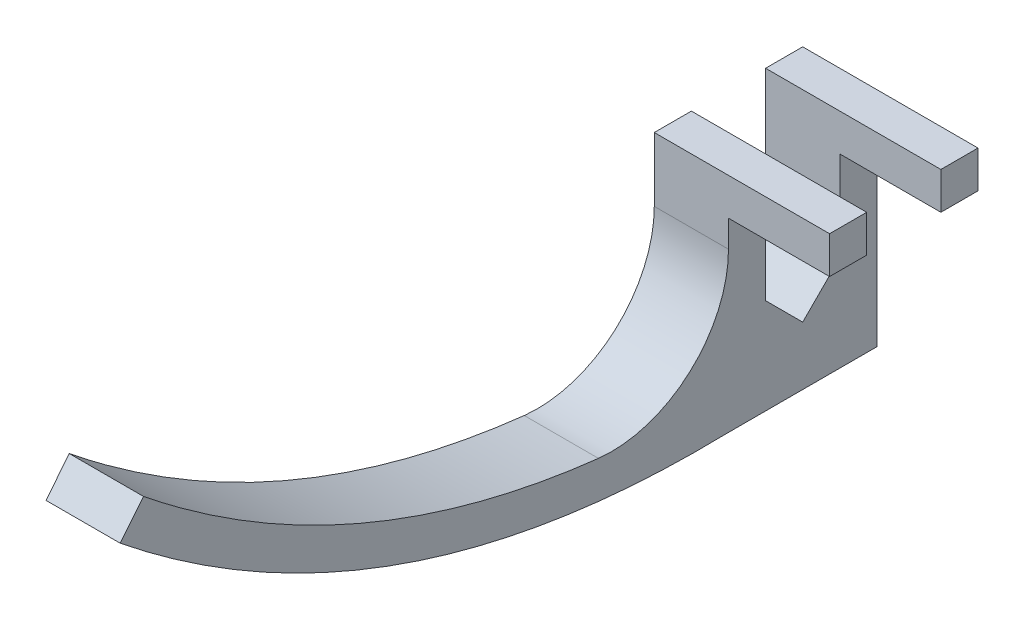
ISO-10303-21;
HEADER;
FILE_DESCRIPTION(('STEP AP214'),'2;1');
FILE_NAME('part.step','',(''),(''),'','','');
FILE_SCHEMA(('AUTOMOTIVE_DESIGN { 1 0 10303 214 1 1 1 1 }'));
ENDSEC;
DATA;
#1=APPLICATION_CONTEXT('core data for automotive mechanical design processes');
#2=APPLICATION_PROTOCOL_DEFINITION('international standard','automotive_design',2000,#1);
#3=PRODUCT_CONTEXT('',#1,'mechanical');
#4=PRODUCT('Part','Part','',(#3));
#5=PRODUCT_RELATED_PRODUCT_CATEGORY('part','',(#4));
#6=PRODUCT_DEFINITION_FORMATION('','',#4);
#7=PRODUCT_DEFINITION_CONTEXT('part definition',#1,'design');
#8=PRODUCT_DEFINITION('design','',#6,#7);
#9=PRODUCT_DEFINITION_SHAPE('','',#8);
#10=(LENGTH_UNIT() NAMED_UNIT(*) SI_UNIT(.MILLI.,.METRE.));
#11=(NAMED_UNIT(*) PLANE_ANGLE_UNIT() SI_UNIT($,.RADIAN.));
#12=(NAMED_UNIT(*) SI_UNIT($,.STERADIAN.) SOLID_ANGLE_UNIT());
#13=UNCERTAINTY_MEASURE_WITH_UNIT(LENGTH_MEASURE(1.E-05),#10,'distance_accuracy_value','');
#14=(GEOMETRIC_REPRESENTATION_CONTEXT(3) GLOBAL_UNCERTAINTY_ASSIGNED_CONTEXT((#13)) GLOBAL_UNIT_ASSIGNED_CONTEXT((#10,
#11,#12)) REPRESENTATION_CONTEXT('',''));
#15=CARTESIAN_POINT('',(0.,0.,0.));
#16=DIRECTION('',(0.,0.,1.));
#17=DIRECTION('',(1.,0.,0.));
#18=AXIS2_PLACEMENT_3D('',#15,#16,#17);
#19=CARTESIAN_POINT('',(12.7,0.,0.));
#20=DIRECTION('',(1.,0.,0.));
#21=DIRECTION('',(0.,0.,-1.));
#22=AXIS2_PLACEMENT_3D('',#19,#20,#21);
#23=PLANE('',#22);
#24=DIRECTION('',(0.,1.,0.));
#25=VECTOR('',#24,1.);
#26=CARTESIAN_POINT('',(12.7,0.,-98.2479628947368));
#27=LINE('',#26,#25);
#28=CARTESIAN_POINT('',(12.7,0.,-98.2479628947368));
#29=VERTEX_POINT('',#28);
#30=CARTESIAN_POINT('',(12.7,31.75,-98.2479628947368));
#31=VERTEX_POINT('',#30);
#32=EDGE_CURVE('E311',#29,#31,#27,.T.);
#33=ORIENTED_EDGE('',*,*,#32,.T.);
#34=DIRECTION('',(0.,0.,-1.));
#35=VECTOR('',#34,1.);
#36=CARTESIAN_POINT('',(12.7,31.75,-91.8979628947368));
#37=LINE('',#36,#35);
#38=CARTESIAN_POINT('',(12.7,31.75,-91.8979628947368));
#39=VERTEX_POINT('',#38);
#40=EDGE_CURVE('E188',#39,#31,#37,.T.);
#41=ORIENTED_EDGE('',*,*,#40,.F.);
#42=DIRECTION('',(0.,-1.,0.));
#43=VECTOR('',#42,1.);
#44=CARTESIAN_POINT('',(12.7,0.,-91.8979628947368));
#45=LINE('',#44,#43);
#46=CARTESIAN_POINT('',(12.7,16.35,-91.8979628947368));
#47=VERTEX_POINT('',#46);
#48=EDGE_CURVE('E305',#39,#47,#45,.T.);
#49=ORIENTED_EDGE('',*,*,#48,.T.);
#50=DIRECTION('',(0.,0.707106781186543,-0.707106781186552));
#51=VECTOR('',#50,1.);
#52=CARTESIAN_POINT('',(12.7,6.35,-81.8979628947367));
#53=LINE('',#52,#51);
#54=CARTESIAN_POINT('',(12.7,10.,-85.5479628947368));
#55=VERTEX_POINT('',#54);
#56=EDGE_CURVE('E50',#47,#55,#53,.F.);
#57=ORIENTED_EDGE('',*,*,#56,.T.);
#58=DIRECTION('',(0.,-0.707106781186551,-0.707106781186544));
#59=VECTOR('',#58,1.);
#60=CARTESIAN_POINT('',(12.7,16.3500000000001,-79.1979628947368));
#61=LINE('',#60,#59);
#62=CARTESIAN_POINT('',(12.7,16.3500000000001,-79.1979628947368));
#63=VERTEX_POINT('',#62);
#64=EDGE_CURVE('E11',#55,#63,#61,.F.);
#65=ORIENTED_EDGE('',*,*,#64,.T.);
#66=DIRECTION('',(0.,1.,0.));
#67=VECTOR('',#66,1.);
#68=CARTESIAN_POINT('',(12.7,0.,-79.1979628947368));
#69=LINE('',#68,#67);
#70=CARTESIAN_POINT('',(12.7,31.75,-79.1979628947368));
#71=VERTEX_POINT('',#70);
#72=EDGE_CURVE('E310',#63,#71,#69,.T.);
#73=ORIENTED_EDGE('',*,*,#72,.T.);
#74=DIRECTION('',(0.,0.,-1.));
#75=VECTOR('',#74,1.);
#76=CARTESIAN_POINT('',(12.7,31.75,-72.8479628947369));
#77=LINE('',#76,#75);
#78=CARTESIAN_POINT('',(12.7,31.75,-72.8479628947369));
#79=VERTEX_POINT('',#78);
#80=EDGE_CURVE('E199',#79,#71,#77,.T.);
#81=ORIENTED_EDGE('',*,*,#80,.F.);
#82=DIRECTION('',(0.,-1.,0.));
#83=VECTOR('',#82,1.);
#84=CARTESIAN_POINT('',(12.7,0.,-72.8479628947369));
#85=LINE('',#84,#83);
#86=CARTESIAN_POINT('',(12.7,27.1526111686898,-72.8479628947369));
#87=VERTEX_POINT('',#86);
#88=EDGE_CURVE('E333',#79,#87,#85,.T.);
#89=ORIENTED_EDGE('',*,*,#88,.T.);
#90=CARTESIAN_POINT('',(12.7,27.1526111686898,-52.8479628947369));
#91=DIRECTION('',(1.,0.,0.));
#92=DIRECTION('',(0.,0.,-1.));
#93=AXIS2_PLACEMENT_3D('',#90,#91,#92);
#94=CIRCLE('',#93,20.);
#95=CARTESIAN_POINT('',(12.7,7.27968692718056,-50.5969893073233));
#96=VERTEX_POINT('',#95);
#97=EDGE_CURVE('E350',#87,#96,#94,.F.);
#98=ORIENTED_EDGE('',*,*,#97,.T.);
#99=CARTESIAN_POINT('',(12.7,6.34904955410612,-72.2622482614912));
#100=CARTESIAN_POINT('',(12.7,6.12290117271,-63.0218832123235));
#101=CARTESIAN_POINT('',(12.7,6.66744561450977,-54.0289140358173));
#102=CARTESIAN_POINT('',(12.7,9.29109763159686,-36.5226944849123));
#103=CARTESIAN_POINT('',(12.7,11.3700864014079,-28.0091870172002));
#104=CARTESIAN_POINT('',(12.7,17.0649267373813,-11.4423787670961));
#105=CARTESIAN_POINT('',(12.7,20.680920682642,-3.38880336935423));
#106=CARTESIAN_POINT('',(12.7,29.4616446560838,12.2730029560284));
#107=CARTESIAN_POINT('',(12.7,34.6266265516634,19.8812726322155));
#108=CARTESIAN_POINT('',(12.7,40.5733192275621,27.2692620301631));
#109=B_SPLINE_CURVE_WITH_KNOTS('',3,(#99,#100,#101,#102,#103,#104,#105,#106,#107,#108),
.UNSPECIFIED.,.F.,.F.,(4,2,2,2,4),(0.,0.25,0.5,0.75,1.),.UNSPECIFIED.);
#110=CARTESIAN_POINT('',(12.7,40.5733192275621,27.2692620301631));
#111=VERTEX_POINT('',#110);
#112=EDGE_CURVE('E218',#96,#111,#109,.T.);
#113=ORIENTED_EDGE('',*,*,#112,.T.);
#114=DIRECTION('',(0.,0.778998181909319,-0.62702618173564));
#115=VECTOR('',#114,1.);
#116=CARTESIAN_POINT('',(12.7,35.6266807724379,31.2508782841844));
#117=LINE('',#116,#115);
#118=CARTESIAN_POINT('',(12.7,35.6266807724379,31.2508782841844));
#119=VERTEX_POINT('',#118);
#120=EDGE_CURVE('E222',#119,#111,#117,.T.);
#121=ORIENTED_EDGE('',*,*,#120,.F.);
#122=CARTESIAN_POINT('',(12.7,0.000950445893875204,-72.4176114241612));
#123=CARTESIAN_POINT('',(12.7,-0.233766761642234,-62.8271263295284));
#124=CARTESIAN_POINT('',(12.7,0.331247938192147,-53.463624564851));
#125=CARTESIAN_POINT('',(12.7,3.06756366550616,-35.2056606386222));
#126=CARTESIAN_POINT('',(12.7,5.23898349846201,-26.3114555703842));
#127=CARTESIAN_POINT('',(12.7,11.1858098291554,-9.01159715382173));
#128=CARTESIAN_POINT('',(12.7,14.9610739477943,-0.606218420846993));
#129=CARTESIAN_POINT('',(12.7,24.1037155632848,15.7011251099699));
#130=CARTESIAN_POINT('',(12.7,29.4708411927377,23.6030511592659));
#131=CARTESIAN_POINT('',(12.7,35.6266807724379,31.2508782841844));
#132=B_SPLINE_CURVE_WITH_KNOTS('',3,(#122,#123,#124,#125,#126,#127,#128,#129,#130,#131),
.UNSPECIFIED.,.F.,.F.,(4,2,2,2,4),(0.,0.25,0.5,0.75,1.),.UNSPECIFIED.);
#133=CARTESIAN_POINT('',(12.7,0.000950445893875204,-72.4176114241612));
#134=VERTEX_POINT('',#133);
#135=EDGE_CURVE('E228',#134,#119,#132,.T.);
#136=ORIENTED_EDGE('',*,*,#135,.F.);
#137=DIRECTION('',(0.,-0.00220852870480646,-0.999997561197506));
#138=VECTOR('',#137,1.);
#139=CARTESIAN_POINT('',(12.7,0.,-72.8479628947369));
#140=LINE('',#139,#138);
#141=CARTESIAN_POINT('',(12.7,0.,-72.8479628947369));
#142=VERTEX_POINT('',#141);
#143=EDGE_CURVE('E363',#134,#142,#140,.T.);
#144=ORIENTED_EDGE('',*,*,#143,.T.);
#145=DIRECTION('',(0.,0.,-1.));
#146=VECTOR('',#145,1.);
#147=CARTESIAN_POINT('',(12.7,0.,0.));
#148=LINE('',#147,#146);
#149=EDGE_CURVE('E315',#142,#29,#148,.T.);
#150=ORIENTED_EDGE('',*,*,#149,.T.);
#151=EDGE_LOOP('',(#33,#41,#49,#57,#65,#73,#81,#89,#98,#113,#121,#136,#144,#150));
#152=FACE_BOUND('',#151,.T.);
#153=ADVANCED_FACE('F35',(#152),#23,.T.);
#154=CARTESIAN_POINT('',(12.7,0.,-72.8479628947369));
#155=DIRECTION('',(0.,0.,-1.));
#156=DIRECTION('',(-1.,0.,0.));
#157=AXIS2_PLACEMENT_3D('',#154,#155,#156);
#158=PLANE('',#157);
#159=DIRECTION('',(0.,-1.,0.));
#160=VECTOR('',#159,1.);
#161=CARTESIAN_POINT('',(0.,0.,-72.8479628947369));
#162=LINE('',#161,#160);
#163=CARTESIAN_POINT('',(0.,38.1,-72.8479628947369));
#164=VERTEX_POINT('',#163);
#165=CARTESIAN_POINT('',(0.,27.1526111686898,-72.8479628947369));
#166=VERTEX_POINT('',#165);
#167=EDGE_CURVE('E319',#164,#166,#162,.T.);
#168=ORIENTED_EDGE('',*,*,#167,.T.);
#169=DIRECTION('',(1.,0.,0.));
#170=VECTOR('',#169,1.);
#171=CARTESIAN_POINT('',(12.7,27.1526111686898,-72.8479628947369));
#172=LINE('',#171,#170);
#173=EDGE_CURVE('E345',#166,#87,#172,.T.);
#174=ORIENTED_EDGE('',*,*,#173,.T.);
#175=ORIENTED_EDGE('',*,*,#88,.F.);
#176=DIRECTION('',(-1.,0.,0.));
#177=VECTOR('',#176,1.);
#178=CARTESIAN_POINT('',(30.,31.75,-72.8479628947369));
#179=LINE('',#178,#177);
#180=CARTESIAN_POINT('',(30.,31.75,-72.8479628947369));
#181=VERTEX_POINT('',#180);
#182=EDGE_CURVE('E215',#181,#79,#179,.T.);
#183=ORIENTED_EDGE('',*,*,#182,.F.);
#184=DIRECTION('',(0.,-1.,0.));
#185=VECTOR('',#184,1.);
#186=CARTESIAN_POINT('',(30.,38.1,-72.8479628947369));
#187=LINE('',#186,#185);
#188=CARTESIAN_POINT('',(30.,38.1,-72.8479628947369));
#189=VERTEX_POINT('',#188);
#190=EDGE_CURVE('E203',#189,#181,#187,.T.);
#191=ORIENTED_EDGE('',*,*,#190,.F.);
#192=DIRECTION('',(-1.,0.,0.));
#193=VECTOR('',#192,1.);
#194=CARTESIAN_POINT('',(12.7,38.1,-72.8479628947369));
#195=LINE('',#194,#193);
#196=EDGE_CURVE('E313',#189,#164,#195,.T.);
#197=ORIENTED_EDGE('',*,*,#196,.T.);
#198=EDGE_LOOP('',(#168,#174,#175,#183,#191,#197));
#199=FACE_BOUND('',#198,.T.);
#200=ADVANCED_FACE('F262',(#199),#158,.F.);
#201=CARTESIAN_POINT('',(12.7,0.,0.));
#202=DIRECTION('',(0.,1.,0.));
#203=DIRECTION('',(0.,0.,1.));
#204=AXIS2_PLACEMENT_3D('',#201,#202,#203);
#205=PLANE('',#204);
#206=DIRECTION('',(0.,0.,-1.));
#207=VECTOR('',#206,1.);
#208=CARTESIAN_POINT('',(0.,0.,0.));
#209=LINE('',#208,#207);
#210=CARTESIAN_POINT('',(0.,0.,-72.8479628947369));
#211=VERTEX_POINT('',#210);
#212=CARTESIAN_POINT('',(0.,0.,-98.2479628947368));
#213=VERTEX_POINT('',#212);
#214=EDGE_CURVE('E322',#211,#213,#209,.T.);
#215=ORIENTED_EDGE('',*,*,#214,.T.);
#216=DIRECTION('',(-1.,0.,0.));
#217=VECTOR('',#216,1.);
#218=CARTESIAN_POINT('',(12.7,0.,-98.2479628947368));
#219=LINE('',#218,#217);
#220=EDGE_CURVE('E339',#29,#213,#219,.T.);
#221=ORIENTED_EDGE('',*,*,#220,.F.);
#222=ORIENTED_EDGE('',*,*,#149,.F.);
#223=DIRECTION('',(-1.,0.,0.));
#224=VECTOR('',#223,1.);
#225=CARTESIAN_POINT('',(12.7,0.,-72.8479628947369));
#226=LINE('',#225,#224);
#227=EDGE_CURVE('E342',#142,#211,#226,.T.);
#228=ORIENTED_EDGE('',*,*,#227,.T.);
#229=EDGE_LOOP('',(#215,#221,#222,#228));
#230=FACE_BOUND('',#229,.T.);
#231=ADVANCED_FACE('F280',(#230),#205,.F.);
#232=CARTESIAN_POINT('',(12.7,0.,-98.2479628947368));
#233=DIRECTION('',(0.,0.,1.));
#234=DIRECTION('',(1.,0.,0.));
#235=AXIS2_PLACEMENT_3D('',#232,#233,#234);
#236=PLANE('',#235);
#237=DIRECTION('',(0.,1.,0.));
#238=VECTOR('',#237,1.);
#239=CARTESIAN_POINT('',(0.,0.,-98.2479628947368));
#240=LINE('',#239,#238);
#241=CARTESIAN_POINT('',(0.,38.1,-98.2479628947368));
#242=VERTEX_POINT('',#241);
#243=EDGE_CURVE('E325',#213,#242,#240,.T.);
#244=ORIENTED_EDGE('',*,*,#243,.T.);
#245=DIRECTION('',(-1.,0.,0.));
#246=VECTOR('',#245,1.);
#247=CARTESIAN_POINT('',(12.7,38.1,-98.2479628947368));
#248=LINE('',#247,#246);
#249=CARTESIAN_POINT('',(30.,38.1,-98.2479628947368));
#250=VERTEX_POINT('',#249);
#251=EDGE_CURVE('E171',#250,#242,#248,.T.);
#252=ORIENTED_EDGE('',*,*,#251,.F.);
#253=DIRECTION('',(0.,1.,0.));
#254=VECTOR('',#253,1.);
#255=CARTESIAN_POINT('',(30.,31.75,-98.2479628947368));
#256=LINE('',#255,#254);
#257=CARTESIAN_POINT('',(30.,31.75,-98.2479628947368));
#258=VERTEX_POINT('',#257);
#259=EDGE_CURVE('E187',#258,#250,#256,.T.);
#260=ORIENTED_EDGE('',*,*,#259,.F.);
#261=DIRECTION('',(-1.,0.,0.));
#262=VECTOR('',#261,1.);
#263=CARTESIAN_POINT('',(30.,31.75,-98.2479628947368));
#264=LINE('',#263,#262);
#265=EDGE_CURVE('E194',#258,#31,#264,.T.);
#266=ORIENTED_EDGE('',*,*,#265,.T.);
#267=ORIENTED_EDGE('',*,*,#32,.F.);
#268=ORIENTED_EDGE('',*,*,#220,.T.);
#269=EDGE_LOOP('',(#244,#252,#260,#266,#267,#268));
#270=FACE_BOUND('',#269,.T.);
#271=ADVANCED_FACE('F277',(#270),#236,.F.);
#272=CARTESIAN_POINT('',(12.7,38.1,0.));
#273=DIRECTION('',(0.,-1.,0.));
#274=DIRECTION('',(0.,0.,-1.));
#275=AXIS2_PLACEMENT_3D('',#272,#273,#274);
#276=PLANE('',#275);
#277=DIRECTION('',(0.,0.,1.));
#278=VECTOR('',#277,1.);
#279=CARTESIAN_POINT('',(0.,38.1,0.));
#280=LINE('',#279,#278);
#281=CARTESIAN_POINT('',(0.,38.1,-91.8979628947368));
#282=VERTEX_POINT('',#281);
#283=EDGE_CURVE('E167',#242,#282,#280,.T.);
#284=ORIENTED_EDGE('',*,*,#283,.T.);
#285=DIRECTION('',(-1.,0.,0.));
#286=VECTOR('',#285,1.);
#287=CARTESIAN_POINT('',(12.7,38.1,-91.8979628947368));
#288=LINE('',#287,#286);
#289=CARTESIAN_POINT('',(30.,38.1,-91.8979628947368));
#290=VERTEX_POINT('',#289);
#291=EDGE_CURVE('E160',#290,#282,#288,.T.);
#292=ORIENTED_EDGE('',*,*,#291,.F.);
#293=DIRECTION('',(0.,0.,1.));
#294=VECTOR('',#293,1.);
#295=CARTESIAN_POINT('',(30.,38.1,-98.2479628947368));
#296=LINE('',#295,#294);
#297=EDGE_CURVE('E165',#250,#290,#296,.T.);
#298=ORIENTED_EDGE('',*,*,#297,.F.);
#299=ORIENTED_EDGE('',*,*,#251,.T.);
#300=EDGE_LOOP('',(#284,#292,#298,#299));
#301=FACE_BOUND('',#300,.T.);
#302=ADVANCED_FACE('F162',(#301),#276,.F.);
#303=CARTESIAN_POINT('',(12.7,0.,-91.8979628947368));
#304=DIRECTION('',(0.,0.,-1.));
#305=DIRECTION('',(-1.,0.,0.));
#306=AXIS2_PLACEMENT_3D('',#303,#304,#305);
#307=PLANE('',#306);
#308=DIRECTION('',(0.,-1.,0.));
#309=VECTOR('',#308,1.);
#310=CARTESIAN_POINT('',(0.,0.,-91.8979628947368));
#311=LINE('',#310,#309);
#312=CARTESIAN_POINT('',(0.,16.35,-91.8979628947368));
#313=VERTEX_POINT('',#312);
#314=EDGE_CURVE('E306',#282,#313,#311,.T.);
#315=ORIENTED_EDGE('',*,*,#314,.T.);
#316=DIRECTION('',(1.,0.,0.));
#317=VECTOR('',#316,1.);
#318=CARTESIAN_POINT('',(12.7,16.35,-91.8979628947368));
#319=LINE('',#318,#317);
#320=EDGE_CURVE('E302',#313,#47,#319,.T.);
#321=ORIENTED_EDGE('',*,*,#320,.T.);
#322=ORIENTED_EDGE('',*,*,#48,.F.);
#323=DIRECTION('',(-1.,0.,0.));
#324=VECTOR('',#323,1.);
#325=CARTESIAN_POINT('',(30.,31.75,-91.8979628947368));
#326=LINE('',#325,#324);
#327=CARTESIAN_POINT('',(30.,31.75,-91.8979628947368));
#328=VERTEX_POINT('',#327);
#329=EDGE_CURVE('E179',#328,#39,#326,.T.);
#330=ORIENTED_EDGE('',*,*,#329,.F.);
#331=DIRECTION('',(0.,-1.,0.));
#332=VECTOR('',#331,1.);
#333=CARTESIAN_POINT('',(30.,38.1,-91.8979628947368));
#334=LINE('',#333,#332);
#335=EDGE_CURVE('E175',#290,#328,#334,.T.);
#336=ORIENTED_EDGE('',*,*,#335,.F.);
#337=ORIENTED_EDGE('',*,*,#291,.T.);
#338=EDGE_LOOP('',(#315,#321,#322,#330,#336,#337));
#339=FACE_BOUND('',#338,.T.);
#340=ADVANCED_FACE('F176',(#339),#307,.F.);
#341=CARTESIAN_POINT('',(12.7,0.,-79.1979628947368));
#342=DIRECTION('',(0.,0.,1.));
#343=DIRECTION('',(0.,-1.,0.));
#344=AXIS2_PLACEMENT_3D('',#341,#342,#343);
#345=PLANE('',#344);
#346=ORIENTED_EDGE('',*,*,#72,.F.);
#347=DIRECTION('',(-1.,0.,0.));
#348=VECTOR('',#347,1.);
#349=CARTESIAN_POINT('',(0.,16.3500000000001,-79.1979628947368));
#350=LINE('',#349,#348);
#351=CARTESIAN_POINT('',(0.,16.3500000000001,-79.1979628947368));
#352=VERTEX_POINT('',#351);
#353=EDGE_CURVE('E307',#63,#352,#350,.T.);
#354=ORIENTED_EDGE('',*,*,#353,.T.);
#355=DIRECTION('',(0.,1.,0.));
#356=VECTOR('',#355,1.);
#357=CARTESIAN_POINT('',(0.,0.,-79.1979628947368));
#358=LINE('',#357,#356);
#359=CARTESIAN_POINT('',(0.,38.1,-79.1979628947368));
#360=VERTEX_POINT('',#359);
#361=EDGE_CURVE('E329',#352,#360,#358,.T.);
#362=ORIENTED_EDGE('',*,*,#361,.T.);
#363=DIRECTION('',(-1.,0.,0.));
#364=VECTOR('',#363,1.);
#365=CARTESIAN_POINT('',(12.7,38.1,-79.1979628947368));
#366=LINE('',#365,#364);
#367=CARTESIAN_POINT('',(30.,38.1,-79.1979628947368));
#368=VERTEX_POINT('',#367);
#369=EDGE_CURVE('E172',#368,#360,#366,.T.);
#370=ORIENTED_EDGE('',*,*,#369,.F.);
#371=DIRECTION('',(0.,1.,0.));
#372=VECTOR('',#371,1.);
#373=CARTESIAN_POINT('',(30.,31.75,-79.1979628947368));
#374=LINE('',#373,#372);
#375=CARTESIAN_POINT('',(30.,31.75,-79.1979628947368));
#376=VERTEX_POINT('',#375);
#377=EDGE_CURVE('E207',#376,#368,#374,.T.);
#378=ORIENTED_EDGE('',*,*,#377,.F.);
#379=DIRECTION('',(-1.,0.,0.));
#380=VECTOR('',#379,1.);
#381=CARTESIAN_POINT('',(30.,31.75,-79.1979628947368));
#382=LINE('',#381,#380);
#383=EDGE_CURVE('E210',#376,#71,#382,.T.);
#384=ORIENTED_EDGE('',*,*,#383,.T.);
#385=EDGE_LOOP('',(#346,#354,#362,#370,#378,#384));
#386=FACE_BOUND('',#385,.T.);
#387=ADVANCED_FACE('F268',(#386),#345,.F.);
#388=CARTESIAN_POINT('',(12.7,38.1,0.));
#389=DIRECTION('',(0.,-1.,0.));
#390=DIRECTION('',(0.,0.,-1.));
#391=AXIS2_PLACEMENT_3D('',#388,#389,#390);
#392=PLANE('',#391);
#393=DIRECTION('',(0.,0.,1.));
#394=VECTOR('',#393,1.);
#395=CARTESIAN_POINT('',(0.,38.1,0.));
#396=LINE('',#395,#394);
#397=EDGE_CURVE('E331',#360,#164,#396,.T.);
#398=ORIENTED_EDGE('',*,*,#397,.T.);
#399=ORIENTED_EDGE('',*,*,#196,.F.);
#400=DIRECTION('',(0.,0.,1.));
#401=VECTOR('',#400,1.);
#402=CARTESIAN_POINT('',(30.,38.1,-79.1979628947368));
#403=LINE('',#402,#401);
#404=EDGE_CURVE('E200',#368,#189,#403,.T.);
#405=ORIENTED_EDGE('',*,*,#404,.F.);
#406=ORIENTED_EDGE('',*,*,#369,.T.);
#407=EDGE_LOOP('',(#398,#399,#405,#406));
#408=FACE_BOUND('',#407,.T.);
#409=ADVANCED_FACE('F265',(#408),#392,.F.);
#410=CARTESIAN_POINT('',(0.,0.,0.));
#411=DIRECTION('',(1.,0.,0.));
#412=DIRECTION('',(0.,0.,-1.));
#413=AXIS2_PLACEMENT_3D('',#410,#411,#412);
#414=PLANE('',#413);
#415=ORIENTED_EDGE('',*,*,#167,.F.);
#416=ORIENTED_EDGE('',*,*,#397,.F.);
#417=ORIENTED_EDGE('',*,*,#361,.F.);
#418=DIRECTION('',(0.,0.707106781186551,0.707106781186544));
#419=VECTOR('',#418,1.);
#420=CARTESIAN_POINT('',(0.,47.7739814473684,-47.7739814473688));
#421=LINE('',#420,#419);
#422=CARTESIAN_POINT('',(0.,10.,-85.5479628947368));
#423=VERTEX_POINT('',#422);
#424=EDGE_CURVE('E44',#352,#423,#421,.F.);
#425=ORIENTED_EDGE('',*,*,#424,.T.);
#426=DIRECTION('',(0.,-0.707106781186543,0.707106781186552));
#427=VECTOR('',#426,1.);
#428=CARTESIAN_POINT('',(0.,-37.7739814473683,-37.7739814473678));
#429=LINE('',#428,#427);
#430=EDGE_CURVE('E303',#423,#313,#429,.F.);
#431=ORIENTED_EDGE('',*,*,#430,.T.);
#432=ORIENTED_EDGE('',*,*,#314,.F.);
#433=ORIENTED_EDGE('',*,*,#283,.F.);
#434=ORIENTED_EDGE('',*,*,#243,.F.);
#435=ORIENTED_EDGE('',*,*,#214,.F.);
#436=DIRECTION('',(0.,-0.00220852870480646,-0.999997561197506));
#437=VECTOR('',#436,1.);
#438=CARTESIAN_POINT('',(0.,0.,-72.8479628947369));
#439=LINE('',#438,#437);
#440=CARTESIAN_POINT('',(0.,0.000950445893875204,-72.4176114241612));
#441=VERTEX_POINT('',#440);
#442=EDGE_CURVE('E365',#441,#211,#439,.T.);
#443=ORIENTED_EDGE('',*,*,#442,.F.);
#444=CARTESIAN_POINT('',(0.,0.000950445893875204,-72.4176114241612));
#445=CARTESIAN_POINT('',(0.,-0.233766761642234,-62.8271263295284));
#446=CARTESIAN_POINT('',(0.,0.331247938192147,-53.463624564851));
#447=CARTESIAN_POINT('',(0.,3.06756366550616,-35.2056606386222));
#448=CARTESIAN_POINT('',(0.,5.23898349846201,-26.3114555703842));
#449=CARTESIAN_POINT('',(0.,11.1858098291554,-9.01159715382173));
#450=CARTESIAN_POINT('',(0.,14.9610739477943,-0.606218420846993));
#451=CARTESIAN_POINT('',(0.,24.1037155632848,15.7011251099699));
#452=CARTESIAN_POINT('',(0.,29.4708411927377,23.6030511592659));
#453=CARTESIAN_POINT('',(0.,35.6266807724379,31.2508782841844));
#454=B_SPLINE_CURVE_WITH_KNOTS('',3,(#444,#445,#446,#447,#448,#449,#450,#451,#452,#453),
.UNSPECIFIED.,.F.,.F.,(4,2,2,2,4),(0.,0.25,0.5,0.75,1.),.UNSPECIFIED.);
#455=CARTESIAN_POINT('',(0.,35.6266807724379,31.2508782841844));
#456=VERTEX_POINT('',#455);
#457=EDGE_CURVE('E402',#441,#456,#454,.T.);
#458=ORIENTED_EDGE('',*,*,#457,.T.);
#459=DIRECTION('',(0.,0.778998181909319,-0.62702618173564));
#460=VECTOR('',#459,1.);
#461=CARTESIAN_POINT('',(0.,35.6266807724379,31.2508782841844));
#462=LINE('',#461,#460);
#463=CARTESIAN_POINT('',(0.,40.5733192275621,27.2692620301631));
#464=VERTEX_POINT('',#463);
#465=EDGE_CURVE('E241',#456,#464,#462,.T.);
#466=ORIENTED_EDGE('',*,*,#465,.T.);
#467=CARTESIAN_POINT('',(0.,6.34904955410612,-72.2622482614912));
#468=CARTESIAN_POINT('',(0.,6.12290117271,-63.0218832123235));
#469=CARTESIAN_POINT('',(0.,6.66744561450977,-54.0289140358173));
#470=CARTESIAN_POINT('',(0.,9.29109763159686,-36.5226944849123));
#471=CARTESIAN_POINT('',(0.,11.3700864014079,-28.0091870172002));
#472=CARTESIAN_POINT('',(0.,17.0649267373813,-11.4423787670961));
#473=CARTESIAN_POINT('',(0.,20.680920682642,-3.38880336935423));
#474=CARTESIAN_POINT('',(0.,29.4616446560838,12.2730029560284));
#475=CARTESIAN_POINT('',(0.,34.6266265516634,19.8812726322155));
#476=CARTESIAN_POINT('',(0.,40.5733192275621,27.2692620301631));
#477=B_SPLINE_CURVE_WITH_KNOTS('',3,(#467,#468,#469,#470,#471,#472,#473,#474,#475,#476),
.UNSPECIFIED.,.F.,.F.,(4,2,2,2,4),(0.,0.25,0.5,0.75,1.),.UNSPECIFIED.);
#478=CARTESIAN_POINT('',(0.,7.27968692718056,-50.5969893073233));
#479=VERTEX_POINT('',#478);
#480=EDGE_CURVE('E233',#479,#464,#477,.T.);
#481=ORIENTED_EDGE('',*,*,#480,.F.);
#482=CARTESIAN_POINT('',(0.,27.1526111686898,-52.8479628947369));
#483=DIRECTION('',(1.,0.,0.));
#484=DIRECTION('',(0.,0.,-1.));
#485=AXIS2_PLACEMENT_3D('',#482,#483,#484);
#486=CIRCLE('',#485,20.);
#487=EDGE_CURVE('E308',#479,#166,#486,.T.);
#488=ORIENTED_EDGE('',*,*,#487,.T.);
#489=EDGE_LOOP('',(#415,#416,#417,#425,#431,#432,#433,#434,#435,#443,#458,#466,#481,#488));
#490=FACE_BOUND('',#489,.T.);
#491=ADVANCED_FACE('F258',(#490),#414,.F.);
#492=CARTESIAN_POINT('',(0.,0.,-72.8479628947369));
#493=DIRECTION('',(0.,-0.999997561197506,0.00220852870480646));
#494=DIRECTION('',(0.,-0.00220852870480646,-0.999997561197506));
#495=AXIS2_PLACEMENT_3D('',#492,#493,#494);
#496=PLANE('',#495);
#497=ORIENTED_EDGE('',*,*,#143,.F.);
#498=DIRECTION('',(1.,0.,0.));
#499=VECTOR('',#498,1.);
#500=CARTESIAN_POINT('',(0.,0.000950445893875204,-72.4176114241612));
#501=LINE('',#500,#499);
#502=EDGE_CURVE('E323',#441,#134,#501,.T.);
#503=ORIENTED_EDGE('',*,*,#502,.F.);
#504=ORIENTED_EDGE('',*,*,#442,.T.);
#505=ORIENTED_EDGE('',*,*,#227,.F.);
#506=EDGE_LOOP('',(#497,#503,#504,#505));
#507=FACE_BOUND('',#506,.T.);
#508=ADVANCED_FACE('F252',(#507),#496,.T.);
#509=DIRECTION('',(1.,0.,0.));
#510=VECTOR('',#509,1.);
#511=SURFACE_OF_LINEAR_EXTRUSION('',#477,#510);
#512=ORIENTED_EDGE('',*,*,#112,.F.);
#513=DIRECTION('',(1.,0.,0.));
#514=VECTOR('',#513,1.);
#515=CARTESIAN_POINT('',(12.7,7.27968692718056,-50.5969893073233));
#516=LINE('',#515,#514);
#517=EDGE_CURVE('E348',#96,#479,#516,.F.);
#518=ORIENTED_EDGE('',*,*,#517,.T.);
#519=ORIENTED_EDGE('',*,*,#480,.T.);
#520=DIRECTION('',(1.,0.,0.));
#521=VECTOR('',#520,1.);
#522=CARTESIAN_POINT('',(0.,40.5733192275621,27.2692620301631));
#523=LINE('',#522,#521);
#524=EDGE_CURVE('E371',#464,#111,#523,.T.);
#525=ORIENTED_EDGE('',*,*,#524,.T.);
#526=EDGE_LOOP('',(#512,#518,#519,#525));
#527=FACE_BOUND('',#526,.T.);
#528=ADVANCED_FACE('F247',(#527),#511,.T.);
#529=DIRECTION('',(1.,0.,0.));
#530=VECTOR('',#529,1.);
#531=SURFACE_OF_LINEAR_EXTRUSION('',#454,#530);
#532=ORIENTED_EDGE('',*,*,#502,.T.);
#533=ORIENTED_EDGE('',*,*,#135,.T.);
#534=DIRECTION('',(1.,0.,0.));
#535=VECTOR('',#534,1.);
#536=CARTESIAN_POINT('',(0.,35.6266807724379,31.2508782841844));
#537=LINE('',#536,#535);
#538=EDGE_CURVE('E368',#456,#119,#537,.T.);
#539=ORIENTED_EDGE('',*,*,#538,.F.);
#540=ORIENTED_EDGE('',*,*,#457,.F.);
#541=EDGE_LOOP('',(#532,#533,#539,#540));
#542=FACE_BOUND('',#541,.T.);
#543=ADVANCED_FACE('F251',(#542),#531,.F.);
#544=CARTESIAN_POINT('',(0.,35.6266807724379,31.2508782841844));
#545=DIRECTION('',(0.,-0.627026181735639,-0.778998181909319));
#546=DIRECTION('',(0.,0.778998181909319,-0.627026181735639));
#547=AXIS2_PLACEMENT_3D('',#544,#545,#546);
#548=PLANE('',#547);
#549=ORIENTED_EDGE('',*,*,#538,.T.);
#550=ORIENTED_EDGE('',*,*,#120,.T.);
#551=ORIENTED_EDGE('',*,*,#524,.F.);
#552=ORIENTED_EDGE('',*,*,#465,.F.);
#553=EDGE_LOOP('',(#549,#550,#551,#552));
#554=FACE_BOUND('',#553,.T.);
#555=ADVANCED_FACE('F254',(#554),#548,.F.);
#556=CARTESIAN_POINT('',(30.,31.75,-72.8479628947369));
#557=DIRECTION('',(0.,1.,0.));
#558=DIRECTION('',(0.,0.,1.));
#559=AXIS2_PLACEMENT_3D('',#556,#557,#558);
#560=PLANE('',#559);
#561=ORIENTED_EDGE('',*,*,#80,.T.);
#562=ORIENTED_EDGE('',*,*,#383,.F.);
#563=DIRECTION('',(0.,0.,-1.));
#564=VECTOR('',#563,1.);
#565=CARTESIAN_POINT('',(30.,31.75,-72.8479628947369));
#566=LINE('',#565,#564);
#567=EDGE_CURVE('E205',#181,#376,#566,.T.);
#568=ORIENTED_EDGE('',*,*,#567,.F.);
#569=ORIENTED_EDGE('',*,*,#182,.T.);
#570=EDGE_LOOP('',(#561,#562,#568,#569));
#571=FACE_BOUND('',#570,.T.);
#572=ADVANCED_FACE('F384',(#571),#560,.F.);
#573=CARTESIAN_POINT('',(30.,0.,0.));
#574=DIRECTION('',(1.,0.,0.));
#575=DIRECTION('',(0.,0.,-1.));
#576=AXIS2_PLACEMENT_3D('',#573,#574,#575);
#577=PLANE('',#576);
#578=ORIENTED_EDGE('',*,*,#404,.T.);
#579=ORIENTED_EDGE('',*,*,#190,.T.);
#580=ORIENTED_EDGE('',*,*,#567,.T.);
#581=ORIENTED_EDGE('',*,*,#377,.T.);
#582=EDGE_LOOP('',(#578,#579,#580,#581));
#583=FACE_BOUND('',#582,.T.);
#584=ADVANCED_FACE('F388',(#583),#577,.T.);
#585=CARTESIAN_POINT('',(30.,31.75,-91.8979628947368));
#586=DIRECTION('',(0.,1.,0.));
#587=DIRECTION('',(0.,0.,1.));
#588=AXIS2_PLACEMENT_3D('',#585,#586,#587);
#589=PLANE('',#588);
#590=ORIENTED_EDGE('',*,*,#40,.T.);
#591=ORIENTED_EDGE('',*,*,#265,.F.);
#592=DIRECTION('',(0.,0.,-1.));
#593=VECTOR('',#592,1.);
#594=CARTESIAN_POINT('',(30.,31.75,-91.8979628947368));
#595=LINE('',#594,#593);
#596=EDGE_CURVE('E182',#328,#258,#595,.T.);
#597=ORIENTED_EDGE('',*,*,#596,.F.);
#598=ORIENTED_EDGE('',*,*,#329,.T.);
#599=EDGE_LOOP('',(#590,#591,#597,#598));
#600=FACE_BOUND('',#599,.T.);
#601=ADVANCED_FACE('F415',(#600),#589,.F.);
#602=CARTESIAN_POINT('',(30.,0.,0.));
#603=DIRECTION('',(1.,0.,0.));
#604=DIRECTION('',(0.,0.,-1.));
#605=AXIS2_PLACEMENT_3D('',#602,#603,#604);
#606=PLANE('',#605);
#607=ORIENTED_EDGE('',*,*,#297,.T.);
#608=ORIENTED_EDGE('',*,*,#335,.T.);
#609=ORIENTED_EDGE('',*,*,#596,.T.);
#610=ORIENTED_EDGE('',*,*,#259,.T.);
#611=EDGE_LOOP('',(#607,#608,#609,#610));
#612=FACE_BOUND('',#611,.T.);
#613=ADVANCED_FACE('F185',(#612),#606,.T.);
#614=CARTESIAN_POINT('',(6.35,27.1526111686898,-52.8479628947369));
#615=DIRECTION('',(1.,0.,0.));
#616=DIRECTION('',(0.,0.,-1.));
#617=AXIS2_PLACEMENT_3D('',#614,#615,#616);
#618=CYLINDRICAL_SURFACE('',#617,20.);
#619=ORIENTED_EDGE('',*,*,#487,.F.);
#620=ORIENTED_EDGE('',*,*,#517,.F.);
#621=ORIENTED_EDGE('',*,*,#97,.F.);
#622=ORIENTED_EDGE('',*,*,#173,.F.);
#623=EDGE_LOOP('',(#619,#620,#621,#622));
#624=FACE_BOUND('',#623,.T.);
#625=ADVANCED_FACE('F288',(#624),#618,.F.);
#626=CARTESIAN_POINT('',(12.7,16.3500000000001,-79.1979628947368));
#627=DIRECTION('',(0.,0.707106781186544,-0.707106781186551));
#628=DIRECTION('',(1.,0.,0.));
#629=AXIS2_PLACEMENT_3D('',#626,#627,#628);
#630=PLANE('',#629);
#631=ORIENTED_EDGE('',*,*,#353,.F.);
#632=ORIENTED_EDGE('',*,*,#64,.F.);
#633=DIRECTION('',(-1.,0.,0.));
#634=VECTOR('',#633,1.);
#635=CARTESIAN_POINT('',(12.7,10.,-85.5479628947368));
#636=LINE('',#635,#634);
#637=EDGE_CURVE('E39',#423,#55,#636,.F.);
#638=ORIENTED_EDGE('',*,*,#637,.F.);
#639=ORIENTED_EDGE('',*,*,#424,.F.);
#640=EDGE_LOOP('',(#631,#632,#638,#639));
#641=FACE_BOUND('',#640,.T.);
#642=ADVANCED_FACE('F37',(#641),#630,.T.);
#643=CARTESIAN_POINT('',(12.7,6.35,-81.8979628947367));
#644=DIRECTION('',(0.,0.707106781186552,0.707106781186543));
#645=DIRECTION('',(1.,0.,0.));
#646=AXIS2_PLACEMENT_3D('',#643,#644,#645);
#647=PLANE('',#646);
#648=ORIENTED_EDGE('',*,*,#56,.F.);
#649=ORIENTED_EDGE('',*,*,#320,.F.);
#650=ORIENTED_EDGE('',*,*,#430,.F.);
#651=ORIENTED_EDGE('',*,*,#637,.T.);
#652=EDGE_LOOP('',(#648,#649,#650,#651));
#653=FACE_BOUND('',#652,.T.);
#654=ADVANCED_FACE('F291',(#653),#647,.T.);
#655=CLOSED_SHELL('',(#153,#200,#231,#271,#302,#340,#387,#409,#491,#508,#528,#543,#555,#572,
#584,#601,#613,#625,#642,#654));
#656=MANIFOLD_SOLID_BREP('B2',#655);
#657=ADVANCED_BREP_SHAPE_REPRESENTATION('',(#18,#656),#14);
#658=SHAPE_DEFINITION_REPRESENTATION(#9,#657);
ENDSEC;
END-ISO-10303-21;
